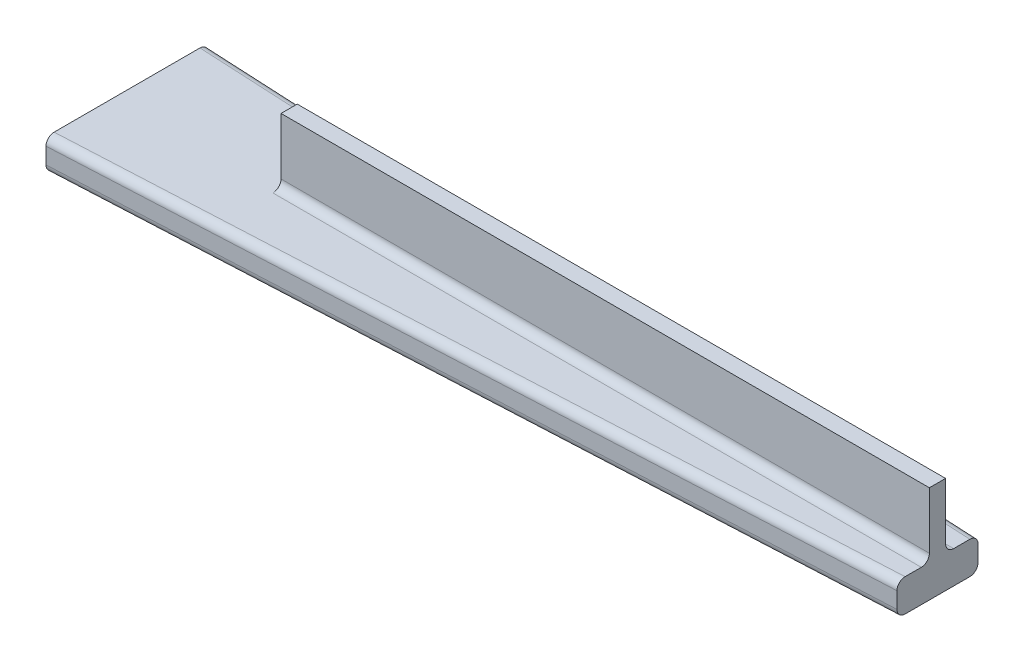
ISO-10303-21;
HEADER;
FILE_DESCRIPTION(('STEP AP214'),'2;1');
FILE_NAME('part.step','',(''),(''),'','','');
FILE_SCHEMA(('AUTOMOTIVE_DESIGN { 1 0 10303 214 1 1 1 1 }'));
ENDSEC;
DATA;
#1=APPLICATION_CONTEXT('core data for automotive mechanical design processes');
#2=APPLICATION_PROTOCOL_DEFINITION('international standard','automotive_design',2000,#1);
#3=PRODUCT_CONTEXT('',#1,'mechanical');
#4=PRODUCT('Part','Part','',(#3));
#5=PRODUCT_RELATED_PRODUCT_CATEGORY('part','',(#4));
#6=PRODUCT_DEFINITION_FORMATION('','',#4);
#7=PRODUCT_DEFINITION_CONTEXT('part definition',#1,'design');
#8=PRODUCT_DEFINITION('design','',#6,#7);
#9=PRODUCT_DEFINITION_SHAPE('','',#8);
#10=(LENGTH_UNIT() NAMED_UNIT(*) SI_UNIT(.MILLI.,.METRE.));
#11=(NAMED_UNIT(*) PLANE_ANGLE_UNIT() SI_UNIT($,.RADIAN.));
#12=(NAMED_UNIT(*) SI_UNIT($,.STERADIAN.) SOLID_ANGLE_UNIT());
#13=UNCERTAINTY_MEASURE_WITH_UNIT(LENGTH_MEASURE(1.E-05),#10,'distance_accuracy_value','');
#14=(GEOMETRIC_REPRESENTATION_CONTEXT(3) GLOBAL_UNCERTAINTY_ASSIGNED_CONTEXT((#13)) GLOBAL_UNIT_ASSIGNED_CONTEXT((#10,
#11,#12)) REPRESENTATION_CONTEXT('',''));
#15=CARTESIAN_POINT('',(0.,0.,0.));
#16=DIRECTION('',(0.,0.,1.));
#17=DIRECTION('',(1.,0.,0.));
#18=AXIS2_PLACEMENT_3D('',#15,#16,#17);
#19=CARTESIAN_POINT('',(0.,2.,-5.));
#20=DIRECTION('',(-0.0499376169438923,0.,0.998752338877845));
#21=DIRECTION('',(0.998752338877845,0.,0.0499376169438923));
#22=AXIS2_PLACEMENT_3D('',#19,#20,#21);
#23=PLANE('',#22);
#24=DIRECTION('',(0.,-1.,0.));
#25=VECTOR('',#24,1.);
#26=CARTESIAN_POINT('',(50.,2.,-2.5));
#27=LINE('',#26,#25);
#28=CARTESIAN_POINT('',(50.,1.5,-2.5));
#29=VERTEX_POINT('',#28);
#30=CARTESIAN_POINT('',(50.,0.5,-2.5));
#31=VERTEX_POINT('',#30);
#32=EDGE_CURVE('E188',#29,#31,#27,.T.);
#33=ORIENTED_EDGE('',*,*,#32,.T.);
#34=DIRECTION('',(-0.998752338877845,0.,-0.0499376169438923));
#35=VECTOR('',#34,1.);
#36=CARTESIAN_POINT('',(0.,0.5,-5.));
#37=LINE('',#36,#35);
#38=CARTESIAN_POINT('',(0.,0.5,-5.));
#39=VERTEX_POINT('',#38);
#40=EDGE_CURVE('E211',#31,#39,#37,.T.);
#41=ORIENTED_EDGE('',*,*,#40,.T.);
#42=DIRECTION('',(0.,-1.,0.));
#43=VECTOR('',#42,1.);
#44=CARTESIAN_POINT('',(0.,2.,-5.));
#45=LINE('',#44,#43);
#46=CARTESIAN_POINT('',(0.,1.5,-5.));
#47=VERTEX_POINT('',#46);
#48=EDGE_CURVE('E204',#47,#39,#45,.T.);
#49=ORIENTED_EDGE('',*,*,#48,.F.);
#50=DIRECTION('',(-0.998752338877845,0.,-0.0499376169438923));
#51=VECTOR('',#50,1.);
#52=CARTESIAN_POINT('',(50.,1.5,-2.5));
#53=LINE('',#52,#51);
#54=EDGE_CURVE('E208',#47,#29,#53,.F.);
#55=ORIENTED_EDGE('',*,*,#54,.T.);
#56=EDGE_LOOP('',(#33,#41,#49,#55));
#57=FACE_BOUND('',#56,.T.);
#58=ADVANCED_FACE('F43',(#57),#23,.F.);
#59=CARTESIAN_POINT('',(0.,2.,5.));
#60=DIRECTION('',(1.,0.,0.));
#61=DIRECTION('',(0.,0.,-1.));
#62=AXIS2_PLACEMENT_3D('',#59,#60,#61);
#63=PLANE('',#62);
#64=ORIENTED_EDGE('',*,*,#48,.T.);
#65=CARTESIAN_POINT('',(0.,0.5,-4.49937539013748));
#66=DIRECTION('',(1.,0.,0.));
#67=DIRECTION('',(0.,0.,-1.));
#68=AXIS2_PLACEMENT_3D('',#65,#66,#67);
#69=ELLIPSE('',#68,0.50062460986252,0.5);
#70=CARTESIAN_POINT('',(0.,0.,-4.49937539013748));
#71=VERTEX_POINT('',#70);
#72=EDGE_CURVE('E224',#39,#71,#69,.F.);
#73=ORIENTED_EDGE('',*,*,#72,.T.);
#74=DIRECTION('',(0.,0.,1.));
#75=VECTOR('',#74,1.);
#76=CARTESIAN_POINT('',(0.,0.,5.));
#77=LINE('',#76,#75);
#78=CARTESIAN_POINT('',(0.,0.,4.49937539013748));
#79=VERTEX_POINT('',#78);
#80=EDGE_CURVE('E169',#71,#79,#77,.T.);
#81=ORIENTED_EDGE('',*,*,#80,.T.);
#82=CARTESIAN_POINT('',(0.,0.5,4.49937539013748));
#83=DIRECTION('',(1.,0.,0.));
#84=DIRECTION('',(0.,0.,-1.));
#85=AXIS2_PLACEMENT_3D('',#82,#83,#84);
#86=ELLIPSE('',#85,0.50062460986252,0.5);
#87=CARTESIAN_POINT('',(0.,0.5,5.));
#88=VERTEX_POINT('',#87);
#89=EDGE_CURVE('E218',#79,#88,#86,.F.);
#90=ORIENTED_EDGE('',*,*,#89,.T.);
#91=DIRECTION('',(0.,-1.,0.));
#92=VECTOR('',#91,1.);
#93=CARTESIAN_POINT('',(0.,2.,5.));
#94=LINE('',#93,#92);
#95=CARTESIAN_POINT('',(0.,1.5,5.));
#96=VERTEX_POINT('',#95);
#97=EDGE_CURVE('E200',#96,#88,#94,.T.);
#98=ORIENTED_EDGE('',*,*,#97,.F.);
#99=CARTESIAN_POINT('',(0.,1.5,4.49937539013748));
#100=DIRECTION('',(1.,0.,0.));
#101=DIRECTION('',(0.,0.,1.));
#102=AXIS2_PLACEMENT_3D('',#99,#100,#101);
#103=ELLIPSE('',#102,0.50062460986252,0.5);
#104=CARTESIAN_POINT('',(0.,2.,4.49937539013748));
#105=VERTEX_POINT('',#104);
#106=EDGE_CURVE('E215',#96,#105,#103,.F.);
#107=ORIENTED_EDGE('',*,*,#106,.T.);
#108=DIRECTION('',(0.,0.,1.));
#109=VECTOR('',#108,1.);
#110=CARTESIAN_POINT('',(0.,2.,5.));
#111=LINE('',#110,#109);
#112=CARTESIAN_POINT('',(0.,2.,-4.49937539013748));
#113=VERTEX_POINT('',#112);
#114=EDGE_CURVE('E180',#113,#105,#111,.T.);
#115=ORIENTED_EDGE('',*,*,#114,.F.);
#116=CARTESIAN_POINT('',(0.,1.5,-4.49937539013748));
#117=DIRECTION('',(1.,0.,0.));
#118=DIRECTION('',(0.,0.,1.));
#119=AXIS2_PLACEMENT_3D('',#116,#117,#118);
#120=ELLIPSE('',#119,0.50062460986252,0.5);
#121=EDGE_CURVE('E221',#113,#47,#120,.F.);
#122=ORIENTED_EDGE('',*,*,#121,.T.);
#123=EDGE_LOOP('',(#64,#73,#81,#90,#98,#107,#115,#122));
#124=FACE_BOUND('',#123,.T.);
#125=ADVANCED_FACE('F315',(#124),#63,.F.);
#126=CARTESIAN_POINT('',(0.,2.,5.));
#127=DIRECTION('',(-0.0499376169438922,0.,-0.998752338877845));
#128=DIRECTION('',(-0.998752338877845,0.,0.0499376169438922));
#129=AXIS2_PLACEMENT_3D('',#126,#127,#128);
#130=PLANE('',#129);
#131=ORIENTED_EDGE('',*,*,#97,.T.);
#132=DIRECTION('',(0.998752338877845,0.,-0.0499376169438922));
#133=VECTOR('',#132,1.);
#134=CARTESIAN_POINT('',(0.,0.5,5.));
#135=LINE('',#134,#133);
#136=CARTESIAN_POINT('',(50.,0.5,2.5));
#137=VERTEX_POINT('',#136);
#138=EDGE_CURVE('E263',#88,#137,#135,.T.);
#139=ORIENTED_EDGE('',*,*,#138,.T.);
#140=DIRECTION('',(0.,-1.,0.));
#141=VECTOR('',#140,1.);
#142=CARTESIAN_POINT('',(50.,2.,2.5));
#143=LINE('',#142,#141);
#144=CARTESIAN_POINT('',(50.,1.5,2.5));
#145=VERTEX_POINT('',#144);
#146=EDGE_CURVE('E196',#145,#137,#143,.T.);
#147=ORIENTED_EDGE('',*,*,#146,.F.);
#148=DIRECTION('',(0.998752338877845,0.,-0.0499376169438922));
#149=VECTOR('',#148,1.);
#150=CARTESIAN_POINT('',(0.,1.5,5.));
#151=LINE('',#150,#149);
#152=EDGE_CURVE('E260',#145,#96,#151,.F.);
#153=ORIENTED_EDGE('',*,*,#152,.T.);
#154=EDGE_LOOP('',(#131,#139,#147,#153));
#155=FACE_BOUND('',#154,.T.);
#156=ADVANCED_FACE('F334',(#155),#130,.F.);
#157=CARTESIAN_POINT('',(50.,2.,2.5));
#158=DIRECTION('',(-1.,0.,0.));
#159=DIRECTION('',(0.,0.,1.));
#160=AXIS2_PLACEMENT_3D('',#157,#158,#159);
#161=PLANE('',#160);
#162=DIRECTION('',(0.,0.,-1.));
#163=VECTOR('',#162,1.);
#164=CARTESIAN_POINT('',(50.,0.,2.5));
#165=LINE('',#164,#163);
#166=CARTESIAN_POINT('',(50.,0.,1.99937539013748));
#167=VERTEX_POINT('',#166);
#168=CARTESIAN_POINT('',(50.,0.,-1.99937539013748));
#169=VERTEX_POINT('',#168);
#170=EDGE_CURVE('E174',#167,#169,#165,.T.);
#171=ORIENTED_EDGE('',*,*,#170,.T.);
#172=CARTESIAN_POINT('',(50.,0.5,-1.99937539013748));
#173=DIRECTION('',(-1.,0.,0.));
#174=DIRECTION('',(0.,0.,-1.));
#175=AXIS2_PLACEMENT_3D('',#172,#173,#174);
#176=ELLIPSE('',#175,0.50062460986252,0.5);
#177=EDGE_CURVE('E242',#169,#31,#176,.F.);
#178=ORIENTED_EDGE('',*,*,#177,.T.);
#179=ORIENTED_EDGE('',*,*,#32,.F.);
#180=CARTESIAN_POINT('',(50.,1.5,-1.99937539013748));
#181=DIRECTION('',(-1.,0.,0.));
#182=DIRECTION('',(0.,0.,1.));
#183=AXIS2_PLACEMENT_3D('',#180,#181,#182);
#184=ELLIPSE('',#183,0.50062460986252,0.5);
#185=CARTESIAN_POINT('',(50.,2.,-1.99937539013748));
#186=VERTEX_POINT('',#185);
#187=EDGE_CURVE('E239',#29,#186,#184,.F.);
#188=ORIENTED_EDGE('',*,*,#187,.T.);
#189=DIRECTION('',(0.,0.,-1.));
#190=VECTOR('',#189,1.);
#191=CARTESIAN_POINT('',(50.,2.,2.5));
#192=LINE('',#191,#190);
#193=CARTESIAN_POINT('',(50.,2.,-0.999999999999999));
#194=VERTEX_POINT('',#193);
#195=EDGE_CURVE('E184',#194,#186,#192,.T.);
#196=ORIENTED_EDGE('',*,*,#195,.F.);
#197=CARTESIAN_POINT('',(50.,2.5,-0.999999999999999));
#198=DIRECTION('',(-1.,0.,0.));
#199=DIRECTION('',(0.,0.,1.));
#200=AXIS2_PLACEMENT_3D('',#197,#198,#199);
#201=CIRCLE('',#200,0.5);
#202=CARTESIAN_POINT('',(50.,2.5,-0.499999999999999));
#203=VERTEX_POINT('',#202);
#204=EDGE_CURVE('E275',#194,#203,#201,.T.);
#205=ORIENTED_EDGE('',*,*,#204,.T.);
#206=DIRECTION('',(0.,-1.,0.));
#207=VECTOR('',#206,1.);
#208=CARTESIAN_POINT('',(50.,6.,-0.499999999999999));
#209=LINE('',#208,#207);
#210=CARTESIAN_POINT('',(50.,6.,-0.499999999999999));
#211=VERTEX_POINT('',#210);
#212=EDGE_CURVE('E295',#211,#203,#209,.T.);
#213=ORIENTED_EDGE('',*,*,#212,.F.);
#214=DIRECTION('',(0.,0.,-1.));
#215=VECTOR('',#214,1.);
#216=CARTESIAN_POINT('',(50.,6.,0.500000000000001));
#217=LINE('',#216,#215);
#218=CARTESIAN_POINT('',(50.,6.,0.500000000000001));
#219=VERTEX_POINT('',#218);
#220=EDGE_CURVE('E159',#219,#211,#217,.T.);
#221=ORIENTED_EDGE('',*,*,#220,.F.);
#222=DIRECTION('',(0.,-1.,0.));
#223=VECTOR('',#222,1.);
#224=CARTESIAN_POINT('',(50.,6.,0.500000000000001));
#225=LINE('',#224,#223);
#226=CARTESIAN_POINT('',(50.,2.5,0.500000000000001));
#227=VERTEX_POINT('',#226);
#228=EDGE_CURVE('E176',#219,#227,#225,.T.);
#229=ORIENTED_EDGE('',*,*,#228,.T.);
#230=CARTESIAN_POINT('',(50.,2.5,1.));
#231=DIRECTION('',(-1.,0.,0.));
#232=DIRECTION('',(0.,0.,1.));
#233=AXIS2_PLACEMENT_3D('',#230,#231,#232);
#234=CIRCLE('',#233,0.5);
#235=CARTESIAN_POINT('',(50.,2.,1.));
#236=VERTEX_POINT('',#235);
#237=EDGE_CURVE('E52',#227,#236,#234,.T.);
#238=ORIENTED_EDGE('',*,*,#237,.T.);
#239=CARTESIAN_POINT('',(50.,2.,1.99937539013748));
#240=VERTEX_POINT('',#239);
#241=EDGE_CURVE('E185',#240,#236,#192,.T.);
#242=ORIENTED_EDGE('',*,*,#241,.F.);
#243=CARTESIAN_POINT('',(50.,1.5,1.99937539013748));
#244=DIRECTION('',(-1.,0.,0.));
#245=DIRECTION('',(0.,0.,1.));
#246=AXIS2_PLACEMENT_3D('',#243,#244,#245);
#247=ELLIPSE('',#246,0.50062460986252,0.5);
#248=EDGE_CURVE('E233',#240,#145,#247,.F.);
#249=ORIENTED_EDGE('',*,*,#248,.T.);
#250=ORIENTED_EDGE('',*,*,#146,.T.);
#251=CARTESIAN_POINT('',(50.,0.5,1.99937539013748));
#252=DIRECTION('',(-1.,0.,0.));
#253=DIRECTION('',(0.,0.,-1.));
#254=AXIS2_PLACEMENT_3D('',#251,#252,#253);
#255=ELLIPSE('',#254,0.50062460986252,0.5);
#256=EDGE_CURVE('E236',#137,#167,#255,.F.);
#257=ORIENTED_EDGE('',*,*,#256,.T.);
#258=EDGE_LOOP('',(#171,#178,#179,#188,#196,#205,#213,#221,#229,#238,#242,#249,#250,#257));
#259=FACE_BOUND('',#258,.T.);
#260=ADVANCED_FACE('F281',(#259),#161,.F.);
#261=CARTESIAN_POINT('',(0.,2.,0.));
#262=DIRECTION('',(0.,1.,0.));
#263=DIRECTION('',(0.,0.,1.));
#264=AXIS2_PLACEMENT_3D('',#261,#262,#263);
#265=PLANE('',#264);
#266=ORIENTED_EDGE('',*,*,#195,.T.);
#267=DIRECTION('',(-0.998752338877845,0.,-0.0499376169438923));
#268=VECTOR('',#267,1.);
#269=CARTESIAN_POINT('',(-0.024968808471948,2.,-4.50062383056108));
#270=LINE('',#269,#268);
#271=EDGE_CURVE('E256',#186,#113,#270,.T.);
#272=ORIENTED_EDGE('',*,*,#271,.T.);
#273=ORIENTED_EDGE('',*,*,#114,.T.);
#274=DIRECTION('',(0.998752338877845,0.,-0.0499376169438922));
#275=VECTOR('',#274,1.);
#276=CARTESIAN_POINT('',(49.9750311915281,2.,2.00062383056108));
#277=LINE('',#276,#275);
#278=EDGE_CURVE('E252',#105,#240,#277,.T.);
#279=ORIENTED_EDGE('',*,*,#278,.T.);
#280=ORIENTED_EDGE('',*,*,#241,.T.);
#281=DIRECTION('',(1.,0.,0.));
#282=VECTOR('',#281,1.);
#283=CARTESIAN_POINT('',(0.,2.,1.));
#284=LINE('',#283,#282);
#285=CARTESIAN_POINT('',(10.,2.,1.));
#286=VERTEX_POINT('',#285);
#287=EDGE_CURVE('E245',#236,#286,#284,.F.);
#288=ORIENTED_EDGE('',*,*,#287,.T.);
#289=DIRECTION('',(0.,0.,1.));
#290=VECTOR('',#289,1.);
#291=CARTESIAN_POINT('',(10.,2.,-0.499999999999994));
#292=LINE('',#291,#290);
#293=CARTESIAN_POINT('',(10.,2.,-0.999999999999994));
#294=VERTEX_POINT('',#293);
#295=EDGE_CURVE('E164',#294,#286,#292,.T.);
#296=ORIENTED_EDGE('',*,*,#295,.F.);
#297=DIRECTION('',(-1.,0.,0.));
#298=VECTOR('',#297,1.);
#299=CARTESIAN_POINT('',(0.,2.,-0.999999999999993));
#300=LINE('',#299,#298);
#301=EDGE_CURVE('E249',#294,#194,#300,.F.);
#302=ORIENTED_EDGE('',*,*,#301,.T.);
#303=EDGE_LOOP('',(#266,#272,#273,#279,#280,#288,#296,#302));
#304=FACE_BOUND('',#303,.T.);
#305=ADVANCED_FACE('F288',(#304),#265,.T.);
#306=CARTESIAN_POINT('',(0.,0.,0.));
#307=DIRECTION('',(0.,1.,0.));
#308=DIRECTION('',(0.,0.,1.));
#309=AXIS2_PLACEMENT_3D('',#306,#307,#308);
#310=PLANE('',#309);
#311=ORIENTED_EDGE('',*,*,#80,.F.);
#312=DIRECTION('',(-0.998752338877845,0.,-0.0499376169438923));
#313=VECTOR('',#312,1.);
#314=CARTESIAN_POINT('',(0.224407750131545,0.,-4.4881550026309));
#315=LINE('',#314,#313);
#316=EDGE_CURVE('E230',#71,#169,#315,.F.);
#317=ORIENTED_EDGE('',*,*,#316,.T.);
#318=ORIENTED_EDGE('',*,*,#170,.F.);
#319=DIRECTION('',(0.998752338877845,0.,-0.0499376169438922));
#320=VECTOR('',#319,1.);
#321=CARTESIAN_POINT('',(0.224407750131545,0.,4.4881550026309));
#322=LINE('',#321,#320);
#323=EDGE_CURVE('E227',#167,#79,#322,.F.);
#324=ORIENTED_EDGE('',*,*,#323,.T.);
#325=EDGE_LOOP('',(#311,#317,#318,#324));
#326=FACE_BOUND('',#325,.T.);
#327=ADVANCED_FACE('F325',(#326),#310,.F.);
#328=CARTESIAN_POINT('',(50.,6.,-0.499999999999999));
#329=DIRECTION('',(0.,0.,1.));
#330=DIRECTION('',(1.,0.,0.));
#331=AXIS2_PLACEMENT_3D('',#328,#329,#330);
#332=PLANE('',#331);
#333=ORIENTED_EDGE('',*,*,#212,.T.);
#334=DIRECTION('',(-1.,0.,0.));
#335=VECTOR('',#334,1.);
#336=CARTESIAN_POINT('',(50.,2.5,-0.499999999999999));
#337=LINE('',#336,#335);
#338=CARTESIAN_POINT('',(10.,2.5,-0.499999999999994));
#339=VERTEX_POINT('',#338);
#340=EDGE_CURVE('E167',#203,#339,#337,.T.);
#341=ORIENTED_EDGE('',*,*,#340,.T.);
#342=DIRECTION('',(0.,-1.,0.));
#343=VECTOR('',#342,1.);
#344=CARTESIAN_POINT('',(10.,6.,-0.499999999999994));
#345=LINE('',#344,#343);
#346=CARTESIAN_POINT('',(10.,6.,-0.499999999999994));
#347=VERTEX_POINT('',#346);
#348=EDGE_CURVE('E148',#347,#339,#345,.T.);
#349=ORIENTED_EDGE('',*,*,#348,.F.);
#350=DIRECTION('',(-1.,0.,0.));
#351=VECTOR('',#350,1.);
#352=CARTESIAN_POINT('',(50.,6.,-0.499999999999999));
#353=LINE('',#352,#351);
#354=EDGE_CURVE('E154',#211,#347,#353,.T.);
#355=ORIENTED_EDGE('',*,*,#354,.F.);
#356=EDGE_LOOP('',(#333,#341,#349,#355));
#357=FACE_BOUND('',#356,.T.);
#358=ADVANCED_FACE('F166',(#357),#332,.F.);
#359=CARTESIAN_POINT('',(10.,6.,-0.499999999999994));
#360=DIRECTION('',(1.,0.,0.));
#361=DIRECTION('',(0.,0.,-1.));
#362=AXIS2_PLACEMENT_3D('',#359,#360,#361);
#363=PLANE('',#362);
#364=ORIENTED_EDGE('',*,*,#295,.T.);
#365=CARTESIAN_POINT('',(10.,2.5,1.));
#366=DIRECTION('',(1.,0.,0.));
#367=DIRECTION('',(0.,0.,-1.));
#368=AXIS2_PLACEMENT_3D('',#365,#366,#367);
#369=CIRCLE('',#368,0.5);
#370=CARTESIAN_POINT('',(10.,2.5,0.500000000000001));
#371=VERTEX_POINT('',#370);
#372=EDGE_CURVE('E11',#286,#371,#369,.T.);
#373=ORIENTED_EDGE('',*,*,#372,.T.);
#374=DIRECTION('',(0.,-1.,0.));
#375=VECTOR('',#374,1.);
#376=CARTESIAN_POINT('',(10.,6.,0.500000000000001));
#377=LINE('',#376,#375);
#378=CARTESIAN_POINT('',(10.,6.,0.500000000000001));
#379=VERTEX_POINT('',#378);
#380=EDGE_CURVE('E149',#379,#371,#377,.T.);
#381=ORIENTED_EDGE('',*,*,#380,.F.);
#382=DIRECTION('',(0.,0.,1.));
#383=VECTOR('',#382,1.);
#384=CARTESIAN_POINT('',(10.,6.,-0.499999999999994));
#385=LINE('',#384,#383);
#386=EDGE_CURVE('E144',#347,#379,#385,.T.);
#387=ORIENTED_EDGE('',*,*,#386,.F.);
#388=ORIENTED_EDGE('',*,*,#348,.T.);
#389=CARTESIAN_POINT('',(10.,2.5,-0.999999999999994));
#390=DIRECTION('',(1.,0.,0.));
#391=DIRECTION('',(0.,0.,-1.));
#392=AXIS2_PLACEMENT_3D('',#389,#390,#391);
#393=CIRCLE('',#392,0.5);
#394=EDGE_CURVE('E65',#339,#294,#393,.T.);
#395=ORIENTED_EDGE('',*,*,#394,.T.);
#396=EDGE_LOOP('',(#364,#373,#381,#387,#388,#395));
#397=FACE_BOUND('',#396,.T.);
#398=ADVANCED_FACE('F146',(#397),#363,.F.);
#399=CARTESIAN_POINT('',(10.,6.,0.500000000000001));
#400=DIRECTION('',(0.,0.,-1.));
#401=DIRECTION('',(-1.,0.,0.));
#402=AXIS2_PLACEMENT_3D('',#399,#400,#401);
#403=PLANE('',#402);
#404=ORIENTED_EDGE('',*,*,#380,.T.);
#405=DIRECTION('',(1.,0.,0.));
#406=VECTOR('',#405,1.);
#407=CARTESIAN_POINT('',(10.,2.5,0.500000000000001));
#408=LINE('',#407,#406);
#409=EDGE_CURVE('E269',#371,#227,#408,.T.);
#410=ORIENTED_EDGE('',*,*,#409,.T.);
#411=ORIENTED_EDGE('',*,*,#228,.F.);
#412=DIRECTION('',(1.,0.,0.));
#413=VECTOR('',#412,1.);
#414=CARTESIAN_POINT('',(10.,6.,0.500000000000001));
#415=LINE('',#414,#413);
#416=EDGE_CURVE('E153',#379,#219,#415,.T.);
#417=ORIENTED_EDGE('',*,*,#416,.F.);
#418=EDGE_LOOP('',(#404,#410,#411,#417));
#419=FACE_BOUND('',#418,.T.);
#420=ADVANCED_FACE('F291',(#419),#403,.F.);
#421=CARTESIAN_POINT('',(0.,6.,0.));
#422=DIRECTION('',(0.,1.,0.));
#423=DIRECTION('',(0.,0.,1.));
#424=AXIS2_PLACEMENT_3D('',#421,#422,#423);
#425=PLANE('',#424);
#426=ORIENTED_EDGE('',*,*,#354,.T.);
#427=ORIENTED_EDGE('',*,*,#386,.T.);
#428=ORIENTED_EDGE('',*,*,#416,.T.);
#429=ORIENTED_EDGE('',*,*,#220,.T.);
#430=EDGE_LOOP('',(#426,#427,#428,#429));
#431=FACE_BOUND('',#430,.T.);
#432=ADVANCED_FACE('F157',(#431),#425,.T.);
#433=CARTESIAN_POINT('',(-0.024968808471948,0.5,-4.50062383056108));
#434=DIRECTION('',(-0.998752338877845,0.,-0.0499376169438923));
#435=DIRECTION('',(-0.0499376169438923,0.,0.998752338877845));
#436=AXIS2_PLACEMENT_3D('',#433,#434,#435);
#437=CYLINDRICAL_SURFACE('',#436,0.5);
#438=ORIENTED_EDGE('',*,*,#177,.F.);
#439=ORIENTED_EDGE('',*,*,#316,.F.);
#440=ORIENTED_EDGE('',*,*,#72,.F.);
#441=ORIENTED_EDGE('',*,*,#40,.F.);
#442=EDGE_LOOP('',(#438,#439,#440,#441));
#443=FACE_BOUND('',#442,.T.);
#444=ADVANCED_FACE('F320',(#443),#437,.T.);
#445=CARTESIAN_POINT('',(0.224407750131545,1.5,-4.4881550026309));
#446=DIRECTION('',(0.998752338877845,0.,0.0499376169438923));
#447=DIRECTION('',(0.0499376169438923,0.,-0.998752338877845));
#448=AXIS2_PLACEMENT_3D('',#445,#446,#447);
#449=CYLINDRICAL_SURFACE('',#448,0.5);
#450=ORIENTED_EDGE('',*,*,#187,.F.);
#451=ORIENTED_EDGE('',*,*,#54,.F.);
#452=ORIENTED_EDGE('',*,*,#121,.F.);
#453=ORIENTED_EDGE('',*,*,#271,.F.);
#454=EDGE_LOOP('',(#450,#451,#452,#453));
#455=FACE_BOUND('',#454,.T.);
#456=ADVANCED_FACE('F311',(#455),#449,.T.);
#457=CARTESIAN_POINT('',(-0.0249688084719461,0.5,4.50062383056108));
#458=DIRECTION('',(0.998752338877845,0.,-0.0499376169438922));
#459=DIRECTION('',(-0.0499376169438922,0.,-0.998752338877845));
#460=AXIS2_PLACEMENT_3D('',#457,#458,#459);
#461=CYLINDRICAL_SURFACE('',#460,0.5);
#462=ORIENTED_EDGE('',*,*,#89,.F.);
#463=ORIENTED_EDGE('',*,*,#323,.F.);
#464=ORIENTED_EDGE('',*,*,#256,.F.);
#465=ORIENTED_EDGE('',*,*,#138,.F.);
#466=EDGE_LOOP('',(#462,#463,#464,#465));
#467=FACE_BOUND('',#466,.T.);
#468=ADVANCED_FACE('F329',(#467),#461,.T.);
#469=CARTESIAN_POINT('',(0.224407750131545,1.5,4.4881550026309));
#470=DIRECTION('',(-0.998752338877845,0.,0.0499376169438922));
#471=DIRECTION('',(0.0499376169438922,0.,0.998752338877845));
#472=AXIS2_PLACEMENT_3D('',#469,#470,#471);
#473=CYLINDRICAL_SURFACE('',#472,0.5);
#474=ORIENTED_EDGE('',*,*,#106,.F.);
#475=ORIENTED_EDGE('',*,*,#152,.F.);
#476=ORIENTED_EDGE('',*,*,#248,.F.);
#477=ORIENTED_EDGE('',*,*,#278,.F.);
#478=EDGE_LOOP('',(#474,#475,#476,#477));
#479=FACE_BOUND('',#478,.T.);
#480=ADVANCED_FACE('F338',(#479),#473,.T.);
#481=CARTESIAN_POINT('',(50.,2.5,-0.999999999999999));
#482=DIRECTION('',(-1.,0.,0.));
#483=DIRECTION('',(0.,0.,1.));
#484=AXIS2_PLACEMENT_3D('',#481,#482,#483);
#485=CYLINDRICAL_SURFACE('',#484,0.5);
#486=ORIENTED_EDGE('',*,*,#204,.F.);
#487=ORIENTED_EDGE('',*,*,#301,.F.);
#488=ORIENTED_EDGE('',*,*,#394,.F.);
#489=ORIENTED_EDGE('',*,*,#340,.F.);
#490=EDGE_LOOP('',(#486,#487,#488,#489));
#491=FACE_BOUND('',#490,.T.);
#492=ADVANCED_FACE('F303',(#491),#485,.F.);
#493=CARTESIAN_POINT('',(10.,2.5,1.));
#494=DIRECTION('',(1.,0.,0.));
#495=DIRECTION('',(0.,0.,-1.));
#496=AXIS2_PLACEMENT_3D('',#493,#494,#495);
#497=CYLINDRICAL_SURFACE('',#496,0.5);
#498=ORIENTED_EDGE('',*,*,#372,.F.);
#499=ORIENTED_EDGE('',*,*,#287,.F.);
#500=ORIENTED_EDGE('',*,*,#237,.F.);
#501=ORIENTED_EDGE('',*,*,#409,.F.);
#502=EDGE_LOOP('',(#498,#499,#500,#501));
#503=FACE_BOUND('',#502,.T.);
#504=ADVANCED_FACE('F45',(#503),#497,.F.);
#505=CLOSED_SHELL('',(#58,#125,#156,#260,#305,#327,#358,#398,#420,#432,#444,#456,#468,#480,#492,#504));
#506=MANIFOLD_SOLID_BREP('B2',#505);
#507=ADVANCED_BREP_SHAPE_REPRESENTATION('',(#18,#506),#14);
#508=SHAPE_DEFINITION_REPRESENTATION(#9,#507);
ENDSEC;
END-ISO-10303-21;
